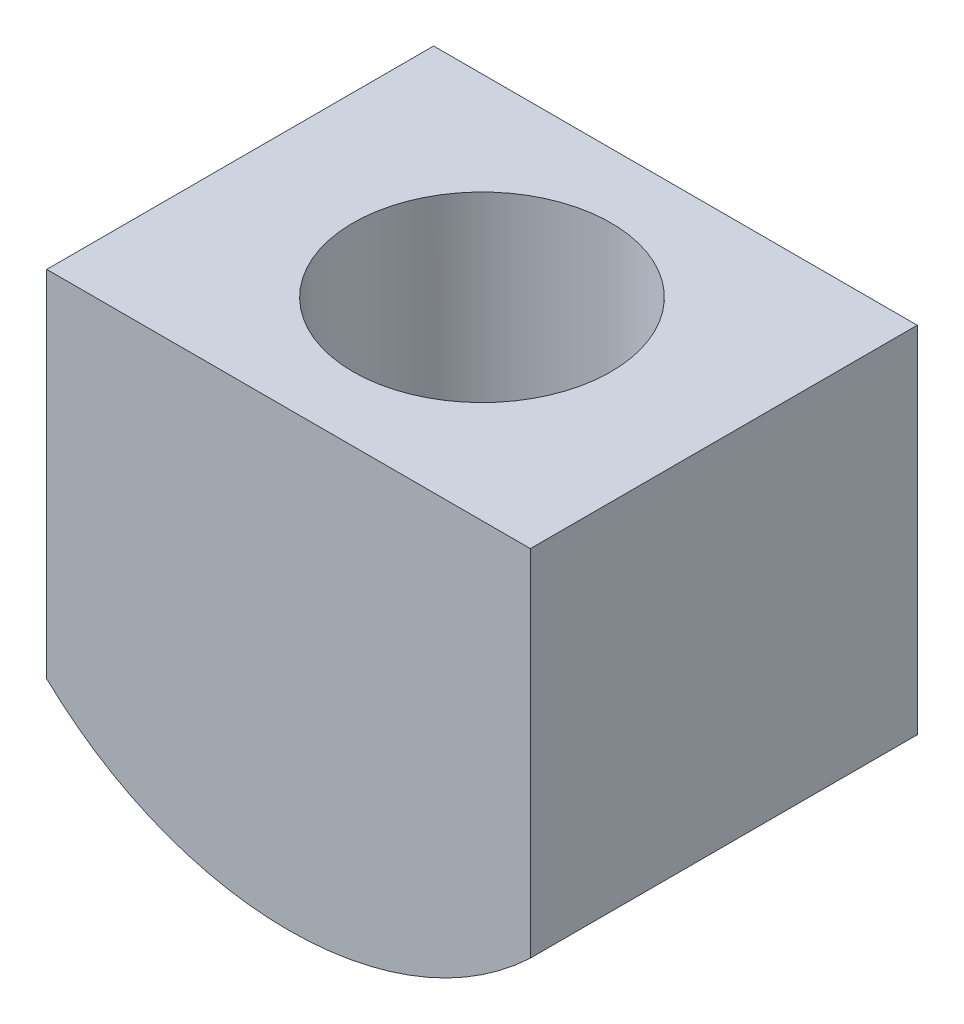
ISO-10303-21;
HEADER;
FILE_DESCRIPTION(('STEP AP214'),'2;1');
FILE_NAME('part.step','',(''),(''),'','','');
FILE_SCHEMA(('AUTOMOTIVE_DESIGN { 1 0 10303 214 1 1 1 1 }'));
ENDSEC;
DATA;
#1=APPLICATION_CONTEXT('core data for automotive mechanical design processes');
#2=APPLICATION_PROTOCOL_DEFINITION('international standard','automotive_design',2000,#1);
#3=PRODUCT_CONTEXT('',#1,'mechanical');
#4=PRODUCT('Part','Part','',(#3));
#5=PRODUCT_RELATED_PRODUCT_CATEGORY('part','',(#4));
#6=PRODUCT_DEFINITION_FORMATION('','',#4);
#7=PRODUCT_DEFINITION_CONTEXT('part definition',#1,'design');
#8=PRODUCT_DEFINITION('design','',#6,#7);
#9=PRODUCT_DEFINITION_SHAPE('','',#8);
#10=(LENGTH_UNIT() NAMED_UNIT(*) SI_UNIT(.MILLI.,.METRE.));
#11=(NAMED_UNIT(*) PLANE_ANGLE_UNIT() SI_UNIT($,.RADIAN.));
#12=(NAMED_UNIT(*) SI_UNIT($,.STERADIAN.) SOLID_ANGLE_UNIT());
#13=UNCERTAINTY_MEASURE_WITH_UNIT(LENGTH_MEASURE(1.E-05),#10,'distance_accuracy_value','');
#14=(GEOMETRIC_REPRESENTATION_CONTEXT(3) GLOBAL_UNCERTAINTY_ASSIGNED_CONTEXT((#13)) GLOBAL_UNIT_ASSIGNED_CONTEXT((#10,
#11,#12)) REPRESENTATION_CONTEXT('',''));
#15=CARTESIAN_POINT('',(0.,0.,0.));
#16=DIRECTION('',(0.,0.,1.));
#17=DIRECTION('',(1.,0.,0.));
#18=AXIS2_PLACEMENT_3D('',#15,#16,#17);
#19=CARTESIAN_POINT('',(0.,0.,12.));
#20=DIRECTION('',(0.,1.,0.));
#21=DIRECTION('',(0.,0.,1.));
#22=AXIS2_PLACEMENT_3D('',#19,#20,#21);
#23=PLANE('',#22);
#24=CARTESIAN_POINT('',(7.5,0.,6.));
#25=DIRECTION('',(0.,1.,0.));
#26=DIRECTION('',(0.,0.,1.));
#27=AXIS2_PLACEMENT_3D('',#24,#25,#26);
#28=CIRCLE('',#27,4.);
#29=CARTESIAN_POINT('',(7.5,0.,10.));
#30=VERTEX_POINT('',#29);
#31=EDGE_CURVE('E144',#30,#30,#28,.T.);
#32=ORIENTED_EDGE('',*,*,#31,.F.);
#33=EDGE_LOOP('',(#32));
#34=FACE_BOUND('',#33,.T.);
#35=DIRECTION('',(1.,0.,0.));
#36=VECTOR('',#35,1.);
#37=CARTESIAN_POINT('',(0.,0.,0.));
#38=LINE('',#37,#36);
#39=CARTESIAN_POINT('',(0.,0.,0.));
#40=VERTEX_POINT('',#39);
#41=CARTESIAN_POINT('',(15.,0.,0.));
#42=VERTEX_POINT('',#41);
#43=EDGE_CURVE('E105',#40,#42,#38,.T.);
#44=ORIENTED_EDGE('',*,*,#43,.F.);
#45=DIRECTION('',(0.,0.,-1.));
#46=VECTOR('',#45,1.);
#47=CARTESIAN_POINT('',(0.,0.,12.));
#48=LINE('',#47,#46);
#49=CARTESIAN_POINT('',(0.,0.,12.));
#50=VERTEX_POINT('',#49);
#51=EDGE_CURVE('E11',#50,#40,#48,.T.);
#52=ORIENTED_EDGE('',*,*,#51,.F.);
#53=DIRECTION('',(1.,0.,0.));
#54=VECTOR('',#53,1.);
#55=CARTESIAN_POINT('',(0.,0.,12.));
#56=LINE('',#55,#54);
#57=CARTESIAN_POINT('',(15.,0.,12.));
#58=VERTEX_POINT('',#57);
#59=EDGE_CURVE('E98',#50,#58,#56,.T.);
#60=ORIENTED_EDGE('',*,*,#59,.T.);
#61=DIRECTION('',(0.,0.,-1.));
#62=VECTOR('',#61,1.);
#63=CARTESIAN_POINT('',(15.,0.,12.));
#64=LINE('',#63,#62);
#65=EDGE_CURVE('E80',#58,#42,#64,.T.);
#66=ORIENTED_EDGE('',*,*,#65,.T.);
#67=EDGE_LOOP('',(#44,#52,#60,#66));
#68=FACE_BOUND('',#67,.T.);
#69=ADVANCED_FACE('F33',(#34,#68),#23,.T.);
#70=CARTESIAN_POINT('',(0.,0.,12.));
#71=DIRECTION('',(1.,0.,0.));
#72=DIRECTION('',(0.,1.,0.));
#73=AXIS2_PLACEMENT_3D('',#70,#71,#72);
#74=PLANE('',#73);
#75=DIRECTION('',(0.,-1.,0.));
#76=VECTOR('',#75,1.);
#77=CARTESIAN_POINT('',(0.,0.,0.));
#78=LINE('',#77,#76);
#79=CARTESIAN_POINT('',(0.,-11.,0.));
#80=VERTEX_POINT('',#79);
#81=EDGE_CURVE('E100',#40,#80,#78,.T.);
#82=ORIENTED_EDGE('',*,*,#81,.T.);
#83=DIRECTION('',(0.,0.,-1.));
#84=VECTOR('',#83,1.);
#85=CARTESIAN_POINT('',(0.,-11.,12.));
#86=LINE('',#85,#84);
#87=CARTESIAN_POINT('',(0.,-11.,12.));
#88=VERTEX_POINT('',#87);
#89=EDGE_CURVE('E46',#88,#80,#86,.T.);
#90=ORIENTED_EDGE('',*,*,#89,.F.);
#91=DIRECTION('',(0.,-1.,0.));
#92=VECTOR('',#91,1.);
#93=CARTESIAN_POINT('',(0.,0.,12.));
#94=LINE('',#93,#92);
#95=EDGE_CURVE('E95',#50,#88,#94,.T.);
#96=ORIENTED_EDGE('',*,*,#95,.F.);
#97=ORIENTED_EDGE('',*,*,#51,.T.);
#98=EDGE_LOOP('',(#82,#90,#96,#97));
#99=FACE_BOUND('',#98,.T.);
#100=ADVANCED_FACE('F114',(#99),#74,.F.);
#101=CARTESIAN_POINT('',(7.5,-3.125,12.));
#102=DIRECTION('',(0.,0.,-1.));
#103=DIRECTION('',(-1.,0.,0.));
#104=AXIS2_PLACEMENT_3D('',#101,#102,#103);
#105=CYLINDRICAL_SURFACE('',#104,10.875);
#106=CARTESIAN_POINT('',(7.5,-14.,10.));
#107=CARTESIAN_POINT('',(7.39156645645477,-14.0000002651375,10.0000003417517));
#108=CARTESIAN_POINT('',(7.28313853568528,-13.9983745766864,9.99558716255888));
#109=CARTESIAN_POINT('',(7.0670584399575,-13.9919164984405,9.97797891738442));
#110=CARTESIAN_POINT('',(6.95940653071548,-13.9870830585121,9.96478097549771));
#111=CARTESIAN_POINT('',(6.74575531743926,-13.9743400678595,9.92973573982943));
#112=CARTESIAN_POINT('',(6.63975522685437,-13.9664320308109,9.90789270207791));
#113=CARTESIAN_POINT('',(6.43009343205253,-13.9477553719956,9.85577368796972));
#114=CARTESIAN_POINT('',(6.3264326524415,-13.9369856399156,9.82549443821272));
#115=CARTESIAN_POINT('',(6.02051263969808,-13.9008372149923,9.72253146105381));
#116=CARTESIAN_POINT('',(5.82267327090004,-13.8715784870299,9.63761568890512));
#117=CARTESIAN_POINT('',(5.44417317849718,-13.8056486936033,9.43794539285376));
#118=CARTESIAN_POINT('',(5.26351688739075,-13.7689757231663,9.32318319820797));
#119=CARTESIAN_POINT('',(4.91693568145917,-13.6903265608857,9.06211417501767));
#120=CARTESIAN_POINT('',(4.75180438956682,-13.6482042406575,8.91479628481395));
#121=CARTESIAN_POINT('',(4.44796555326509,-13.5641389327974,8.59495246645141));
#122=CARTESIAN_POINT('',(4.30926565722773,-13.5221960004962,8.42241926725754));
#123=CARTESIAN_POINT('',(4.05725627090213,-13.4415553199034,8.04938475827063));
#124=CARTESIAN_POINT('',(3.94505319444674,-13.4030309906176,7.84809469039769));
#125=CARTESIAN_POINT('',(3.75644536107267,-13.3358532315306,7.42785962895826));
#126=CARTESIAN_POINT('',(3.68002692258042,-13.3071960303323,7.20892142041022));
#127=CARTESIAN_POINT('',(3.56826681519128,-13.2645547026998,6.76873770665004));
#128=CARTESIAN_POINT('',(3.53141276275238,-13.2500324856103,6.54793003720729));
#129=CARTESIAN_POINT('',(3.4950986941734,-13.2357274562166,6.10282374646989));
#130=CARTESIAN_POINT('',(3.49562397758266,-13.2359388495146,5.87852653223169));
#131=CARTESIAN_POINT('',(3.53289400032615,-13.2506118156373,5.44646785408703));
#132=CARTESIAN_POINT('',(3.56756432137217,-13.2642572140383,5.23849464811145));
#133=CARTESIAN_POINT('',(3.6687190802749,-13.3029080550515,4.83155597833418));
#134=CARTESIAN_POINT('',(3.73520812512883,-13.3279151426833,4.63259182351067));
#135=CARTESIAN_POINT('',(3.89929020718986,-13.386978847633,4.24500515360556));
#136=CARTESIAN_POINT('',(3.99743472891264,-13.4211939868971,4.0566413233109));
#137=CARTESIAN_POINT('',(4.22165781469522,-13.4947633838623,3.69844476838524));
#138=CARTESIAN_POINT('',(4.34774576039568,-13.534119365708,3.52861829607915));
#139=CARTESIAN_POINT('',(4.63385160776991,-13.6166320684048,3.2008017966339));
#140=CARTESIAN_POINT('',(4.79553275429248,-13.6598702552485,3.04428044254189));
#141=CARTESIAN_POINT('',(5.14335400499677,-13.743087759049,2.7601459144624));
#142=CARTESIAN_POINT('',(5.32949758239658,-13.7830666119314,2.63253685251363));
#143=CARTESIAN_POINT('',(5.72459131070588,-13.8560028410564,2.40831124317893));
#144=CARTESIAN_POINT('',(5.93383078937757,-13.8888510466143,2.3121664793362));
#145=CARTESIAN_POINT('',(6.36702140112357,-13.9430186870465,2.15692380476825));
#146=CARTESIAN_POINT('',(6.59096621312065,-13.9643430395279,2.09781008995922));
#147=CARTESIAN_POINT('',(7.03483668676424,-13.9922047779985,2.02109084188582));
#148=CARTESIAN_POINT('',(7.25437645429453,-13.9994464226097,2.00150642639728));
#149=CARTESIAN_POINT('',(7.69369844129096,-14.0004915956513,1.99866208827928));
#150=CARTESIAN_POINT('',(7.91348059955232,-13.9942979701524,2.01539447245293));
#151=CARTESIAN_POINT('',(8.33861135444805,-13.9696335984814,2.08319248979716));
#152=CARTESIAN_POINT('',(8.54419368792317,-13.9516214072603,2.13297655462144));
#153=CARTESIAN_POINT('',(8.94395480584151,-13.9055907471684,2.26379274534362));
#154=CARTESIAN_POINT('',(9.13813210266161,-13.8775709763128,2.34482893724848));
#155=CARTESIAN_POINT('',(9.51586208961237,-13.813297895501,2.53840468533186));
#156=CARTESIAN_POINT('',(9.69894468922913,-13.7768297782773,2.65178806238167));
#157=CARTESIAN_POINT('',(10.0440876588453,-13.6997136092669,2.90587973811976));
#158=CARTESIAN_POINT('',(10.2061404476528,-13.6590640594993,3.04659784551343));
#159=CARTESIAN_POINT('',(10.5140692168737,-13.575258153532,3.3606083696378));
#160=CARTESIAN_POINT('',(10.6585389305832,-13.5320884279671,3.5352798079065));
#161=CARTESIAN_POINT('',(10.9163754973915,-13.4503258133629,3.90725376169221));
#162=CARTESIAN_POINT('',(11.0297401070405,-13.4117332545648,4.10455790813456));
#163=CARTESIAN_POINT('',(11.2221232335669,-13.3437045243839,4.51750213678385));
#164=CARTESIAN_POINT('',(11.3010438170826,-13.3142945280371,4.73319244385634));
#165=CARTESIAN_POINT('',(11.4209548069667,-13.2687632143128,5.17617671153519));
#166=CARTESIAN_POINT('',(11.4619674738555,-13.2526340986629,5.40346377936333));
#167=CARTESIAN_POINT('',(11.5029506563567,-13.236500845704,5.84801758161556));
#168=CARTESIAN_POINT('',(11.5053074243782,-13.2355592382944,6.06503224290861));
#169=CARTESIAN_POINT('',(11.4749826526227,-13.2475193778678,6.49618989561998));
#170=CARTESIAN_POINT('',(11.4423041813159,-13.2604199125229,6.71033313686112));
#171=CARTESIAN_POINT('',(11.3446660405935,-13.2978444272267,7.12355065143842));
#172=CARTESIAN_POINT('',(11.2806439093503,-13.3220299251031,7.32287968116564));
#173=CARTESIAN_POINT('',(11.1229509489089,-13.379113885928,7.70809098673163));
#174=CARTESIAN_POINT('',(11.0292727642822,-13.4120145101106,7.89396991254812));
#175=CARTESIAN_POINT('',(10.8093719217906,-13.4849093993266,8.25730088268711));
#176=CARTESIAN_POINT('',(10.6817342068543,-13.5251796940982,8.43384094006973));
#177=CARTESIAN_POINT('',(10.399801351431,-13.607287240123,8.76374747095839));
#178=CARTESIAN_POINT('',(10.2454979044997,-13.6491249764481,8.91710669558612));
#179=CARTESIAN_POINT('',(9.90500268580633,-13.7322475671876,9.20436835980326));
#180=CARTESIAN_POINT('',(9.71758182563241,-13.7733941670266,9.33687061397758));
#181=CARTESIAN_POINT('',(9.42090836949607,-13.8294827950588,9.51045669432762));
#182=CARTESIAN_POINT('',(9.31936176234917,-13.8472493562519,9.56414862717565));
#183=CARTESIAN_POINT('',(9.11172362815612,-13.8804170222729,9.6627215849039));
#184=CARTESIAN_POINT('',(9.00563407628972,-13.8958191420214,9.70760639249798));
#185=CARTESIAN_POINT('',(8.78663855404707,-13.9241999356803,9.7892745701568));
#186=CARTESIAN_POINT('',(8.67362500222751,-13.9370990627916,9.82579715388001));
#187=CARTESIAN_POINT('',(8.44452869205835,-13.9595155670699,9.88869731644368));
#188=CARTESIAN_POINT('',(8.32844728384845,-13.9690344060996,9.9150792811741));
#189=CARTESIAN_POINT('',(8.09417378352018,-13.9843904231733,9.95741392623884));
#190=CARTESIAN_POINT('',(7.97598200431721,-13.9902281424497,9.97336813977096));
#191=CARTESIAN_POINT('',(7.73852448362624,-13.9980326085727,9.99466050470487));
#192=CARTESIAN_POINT('',(7.61925884106368,-13.9999997083929,9.99999962413002));
#193=CARTESIAN_POINT('',(7.5,-14.,10.));
#194=B_SPLINE_CURVE_WITH_KNOTS('',3,(#106,#107,#108,#109,#110,#111,#112,#113,#114,#115,#116,
#117,#118,#119,#120,#121,#122,#123,#124,#125,#126,#127,#128,#129,#130,#131,#132,#133,#134,#135,
#136,#137,#138,#139,#140,#141,#142,#143,#144,#145,#146,#147,#148,#149,#150,#151,#152,#153,#154,
#155,#156,#157,#158,#159,#160,#161,#162,#163,#164,#165,#166,#167,#168,#169,#170,#171,#172,#173,
#174,#175,#176,#177,#178,#179,#180,#181,#182,#183,#184,#185,#186,#187,#188,#189,#190,#191,#192,
#193),.UNSPECIFIED.,.T.,.F.,(4,2,2,2,2,2,2,2,2,2,2,2,2,2,2,2,2,2,2,2,2,2,2,2,2,2,2,2,2,2,2,2,2,
2,2,2,2,2,2,2,2,2,2,4),(0.,0.325188726960372,0.650483964730306,0.975619256602031,
1.30088088287093,1.94947116136496,2.59822829719136,3.27101814927877,3.94400238986362,
4.64145350212389,5.33863773910056,6.00810237198972,6.67730372097692,7.30820928905466,
7.93920623289047,8.58185055206553,9.22471095844516,9.9090111232426,10.5934085513377,
11.2876421572915,11.9815792765243,12.6398179079012,13.2979171144061,13.9318825598599,
14.5659305141936,15.2183274198223,15.8709588633304,16.5599886001256,17.2490680200087,
17.9400941075562,18.6307141482224,19.2785293500063,19.9262878192145,20.5557563199394,
21.1853810667656,21.8470878115114,22.5090010523859,23.2048414412281,23.5531766510566,
23.9013619197173,24.2592555640385,24.6169942421667,24.9746803099481,25.332333757731),.UNSPECIFIED.);
#195=CARTESIAN_POINT('',(7.5,-14.,10.));
#196=VERTEX_POINT('',#195);
#197=EDGE_CURVE('E36',#196,#196,#194,.T.);
#198=ORIENTED_EDGE('',*,*,#197,.F.);
#199=EDGE_LOOP('',(#198));
#200=FACE_BOUND('',#199,.T.);
#201=CARTESIAN_POINT('',(7.5,-3.125,0.));
#202=DIRECTION('',(0.,0.,-1.));
#203=DIRECTION('',(-1.,0.,0.));
#204=AXIS2_PLACEMENT_3D('',#201,#202,#203);
#205=CIRCLE('',#204,10.875);
#206=CARTESIAN_POINT('',(15.,-11.,0.));
#207=VERTEX_POINT('',#206);
#208=EDGE_CURVE('E88',#207,#80,#205,.T.);
#209=ORIENTED_EDGE('',*,*,#208,.F.);
#210=DIRECTION('',(0.,0.,-1.));
#211=VECTOR('',#210,1.);
#212=CARTESIAN_POINT('',(15.,-11.,12.));
#213=LINE('',#212,#211);
#214=CARTESIAN_POINT('',(15.,-11.,12.));
#215=VERTEX_POINT('',#214);
#216=EDGE_CURVE('E83',#215,#207,#213,.T.);
#217=ORIENTED_EDGE('',*,*,#216,.F.);
#218=CARTESIAN_POINT('',(7.5,-3.125,12.));
#219=DIRECTION('',(0.,0.,-1.));
#220=DIRECTION('',(-1.,0.,0.));
#221=AXIS2_PLACEMENT_3D('',#218,#219,#220);
#222=CIRCLE('',#221,10.875);
#223=EDGE_CURVE('E86',#215,#88,#222,.T.);
#224=ORIENTED_EDGE('',*,*,#223,.T.);
#225=ORIENTED_EDGE('',*,*,#89,.T.);
#226=EDGE_LOOP('',(#209,#217,#224,#225));
#227=FACE_BOUND('',#226,.T.);
#228=ADVANCED_FACE('F85',(#200,#227),#105,.T.);
#229=CARTESIAN_POINT('',(15.,0.,12.));
#230=DIRECTION('',(1.,0.,0.));
#231=DIRECTION('',(0.,0.,-1.));
#232=AXIS2_PLACEMENT_3D('',#229,#230,#231);
#233=PLANE('',#232);
#234=DIRECTION('',(0.,-1.,0.));
#235=VECTOR('',#234,1.);
#236=CARTESIAN_POINT('',(15.,0.,0.));
#237=LINE('',#236,#235);
#238=EDGE_CURVE('E108',#42,#207,#237,.T.);
#239=ORIENTED_EDGE('',*,*,#238,.F.);
#240=ORIENTED_EDGE('',*,*,#65,.F.);
#241=DIRECTION('',(0.,-1.,0.));
#242=VECTOR('',#241,1.);
#243=CARTESIAN_POINT('',(15.,0.,12.));
#244=LINE('',#243,#242);
#245=EDGE_CURVE('E94',#58,#215,#244,.T.);
#246=ORIENTED_EDGE('',*,*,#245,.T.);
#247=ORIENTED_EDGE('',*,*,#216,.T.);
#248=EDGE_LOOP('',(#239,#240,#246,#247));
#249=FACE_BOUND('',#248,.T.);
#250=ADVANCED_FACE('F97',(#249),#233,.T.);
#251=CARTESIAN_POINT('',(7.5,-3.125,12.));
#252=DIRECTION('',(0.,0.,-1.));
#253=DIRECTION('',(-1.,0.,0.));
#254=AXIS2_PLACEMENT_3D('',#251,#252,#253);
#255=PLANE('',#254);
#256=ORIENTED_EDGE('',*,*,#59,.F.);
#257=ORIENTED_EDGE('',*,*,#95,.T.);
#258=ORIENTED_EDGE('',*,*,#223,.F.);
#259=ORIENTED_EDGE('',*,*,#245,.F.);
#260=EDGE_LOOP('',(#256,#257,#258,#259));
#261=FACE_BOUND('',#260,.T.);
#262=ADVANCED_FACE('F93',(#261),#255,.F.);
#263=CARTESIAN_POINT('',(7.5,-3.125,0.));
#264=DIRECTION('',(0.,0.,-1.));
#265=DIRECTION('',(-1.,0.,0.));
#266=AXIS2_PLACEMENT_3D('',#263,#264,#265);
#267=PLANE('',#266);
#268=ORIENTED_EDGE('',*,*,#43,.T.);
#269=ORIENTED_EDGE('',*,*,#238,.T.);
#270=ORIENTED_EDGE('',*,*,#208,.T.);
#271=ORIENTED_EDGE('',*,*,#81,.F.);
#272=EDGE_LOOP('',(#268,#269,#270,#271));
#273=FACE_BOUND('',#272,.T.);
#274=ADVANCED_FACE('F113',(#273),#267,.T.);
#275=CARTESIAN_POINT('',(7.5,-21.,6.));
#276=DIRECTION('',(0.,1.,0.));
#277=DIRECTION('',(0.,0.,1.));
#278=AXIS2_PLACEMENT_3D('',#275,#276,#277);
#279=CYLINDRICAL_SURFACE('',#278,4.);
#280=ORIENTED_EDGE('',*,*,#197,.T.);
#281=EDGE_LOOP('',(#280));
#282=FACE_BOUND('',#281,.T.);
#283=ORIENTED_EDGE('',*,*,#31,.T.);
#284=EDGE_LOOP('',(#283));
#285=FACE_BOUND('',#284,.T.);
#286=ADVANCED_FACE('F133',(#282,#285),#279,.F.);
#287=CLOSED_SHELL('',(#69,#100,#228,#250,#262,#274,#286));
#288=MANIFOLD_SOLID_BREP('B2',#287);
#289=ADVANCED_BREP_SHAPE_REPRESENTATION('',(#18,#288),#14);
#290=SHAPE_DEFINITION_REPRESENTATION(#9,#289);
ENDSEC;
END-ISO-10303-21;
